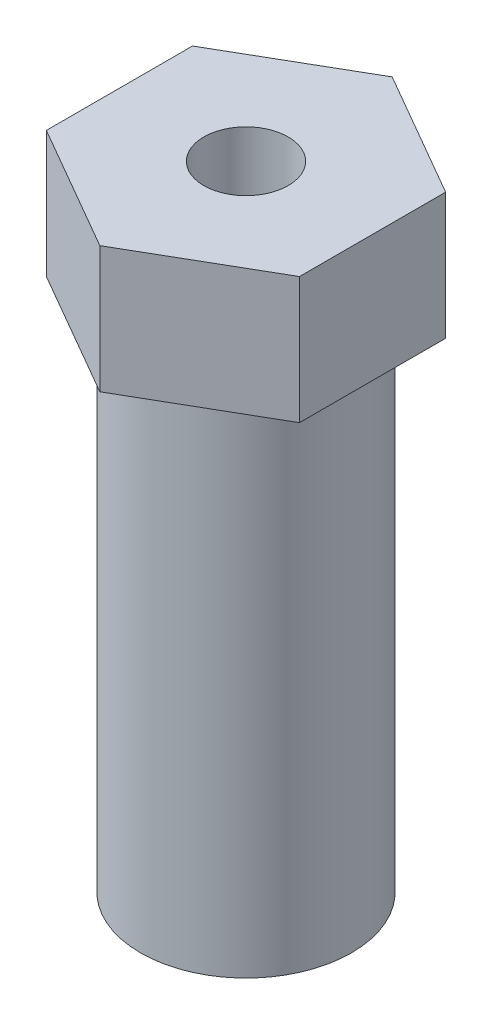
ISO-10303-21;
HEADER;
FILE_DESCRIPTION(('STEP AP214'),'2;1');
FILE_NAME('part.step','',(''),(''),'','','');
FILE_SCHEMA(('AUTOMOTIVE_DESIGN { 1 0 10303 214 1 1 1 1 }'));
ENDSEC;
DATA;
#1=APPLICATION_CONTEXT('core data for automotive mechanical design processes');
#2=APPLICATION_PROTOCOL_DEFINITION('international standard','automotive_design',2000,#1);
#3=PRODUCT_CONTEXT('',#1,'mechanical');
#4=PRODUCT('Part','Part','',(#3));
#5=PRODUCT_RELATED_PRODUCT_CATEGORY('part','',(#4));
#6=PRODUCT_DEFINITION_FORMATION('','',#4);
#7=PRODUCT_DEFINITION_CONTEXT('part definition',#1,'design');
#8=PRODUCT_DEFINITION('design','',#6,#7);
#9=PRODUCT_DEFINITION_SHAPE('','',#8);
#10=(LENGTH_UNIT() NAMED_UNIT(*) SI_UNIT(.MILLI.,.METRE.));
#11=(NAMED_UNIT(*) PLANE_ANGLE_UNIT() SI_UNIT($,.RADIAN.));
#12=(NAMED_UNIT(*) SI_UNIT($,.STERADIAN.) SOLID_ANGLE_UNIT());
#13=UNCERTAINTY_MEASURE_WITH_UNIT(LENGTH_MEASURE(1.E-05),#10,'distance_accuracy_value','');
#14=(GEOMETRIC_REPRESENTATION_CONTEXT(3) GLOBAL_UNCERTAINTY_ASSIGNED_CONTEXT((#13)) GLOBAL_UNIT_ASSIGNED_CONTEXT((#10,
#11,#12)) REPRESENTATION_CONTEXT('',''));
#15=CARTESIAN_POINT('',(0.,0.,0.));
#16=DIRECTION('',(0.,0.,1.));
#17=DIRECTION('',(1.,0.,0.));
#18=AXIS2_PLACEMENT_3D('',#15,#16,#17);
#19=CARTESIAN_POINT('',(0.,30.,0.));
#20=DIRECTION('',(0.,-1.,0.));
#21=DIRECTION('',(0.,0.,-1.));
#22=AXIS2_PLACEMENT_3D('',#19,#20,#21);
#23=CYLINDRICAL_SURFACE('',#22,5.);
#24=CARTESIAN_POINT('',(0.,0.,0.));
#25=DIRECTION('',(0.,1.,0.));
#26=DIRECTION('',(0.,0.,1.));
#27=AXIS2_PLACEMENT_3D('',#24,#25,#26);
#28=CIRCLE('',#27,5.);
#29=CARTESIAN_POINT('',(0.,0.,5.));
#30=VERTEX_POINT('',#29);
#31=EDGE_CURVE('E53',#30,#30,#28,.T.);
#32=ORIENTED_EDGE('',*,*,#31,.T.);
#33=EDGE_LOOP('',(#32));
#34=FACE_BOUND('',#33,.T.);
#35=CARTESIAN_POINT('',(0.,24.,0.));
#36=DIRECTION('',(0.,1.,0.));
#37=DIRECTION('',(0.,0.,1.));
#38=AXIS2_PLACEMENT_3D('',#35,#36,#37);
#39=CIRCLE('',#38,5.);
#40=CARTESIAN_POINT('',(0.,24.,5.));
#41=VERTEX_POINT('',#40);
#42=EDGE_CURVE('E11',#41,#41,#39,.T.);
#43=ORIENTED_EDGE('',*,*,#42,.F.);
#44=EDGE_LOOP('',(#43));
#45=FACE_BOUND('',#44,.T.);
#46=ADVANCED_FACE('F43',(#34,#45),#23,.T.);
#47=CARTESIAN_POINT('',(0.,30.,0.));
#48=DIRECTION('',(0.,-1.,0.));
#49=DIRECTION('',(0.,0.,-1.));
#50=AXIS2_PLACEMENT_3D('',#47,#48,#49);
#51=CYLINDRICAL_SURFACE('',#50,2.5);
#52=CARTESIAN_POINT('',(0.,0.,0.));
#53=DIRECTION('',(0.,1.,0.));
#54=DIRECTION('',(0.,0.,1.));
#55=AXIS2_PLACEMENT_3D('',#52,#53,#54);
#56=CIRCLE('',#55,2.5);
#57=CARTESIAN_POINT('',(0.,0.,2.5));
#58=VERTEX_POINT('',#57);
#59=EDGE_CURVE('E172',#58,#58,#56,.T.);
#60=ORIENTED_EDGE('',*,*,#59,.F.);
#61=EDGE_LOOP('',(#60));
#62=FACE_BOUND('',#61,.T.);
#63=CARTESIAN_POINT('',(0.,24.,0.));
#64=DIRECTION('',(0.,1.,0.));
#65=DIRECTION('',(0.,0.,1.));
#66=AXIS2_PLACEMENT_3D('',#63,#64,#65);
#67=CIRCLE('',#66,2.5);
#68=CARTESIAN_POINT('',(0.,24.,2.5));
#69=VERTEX_POINT('',#68);
#70=EDGE_CURVE('E46',#69,#69,#67,.T.);
#71=ORIENTED_EDGE('',*,*,#70,.T.);
#72=EDGE_LOOP('',(#71));
#73=FACE_BOUND('',#72,.T.);
#74=ADVANCED_FACE('F185',(#62,#73),#51,.F.);
#75=CARTESIAN_POINT('',(0.,0.,0.));
#76=DIRECTION('',(0.,1.,0.));
#77=DIRECTION('',(0.,0.,1.));
#78=AXIS2_PLACEMENT_3D('',#75,#76,#77);
#79=PLANE('',#78);
#80=ORIENTED_EDGE('',*,*,#31,.F.);
#81=EDGE_LOOP('',(#80));
#82=FACE_BOUND('',#81,.T.);
#83=ORIENTED_EDGE('',*,*,#59,.T.);
#84=EDGE_LOOP('',(#83));
#85=FACE_BOUND('',#84,.T.);
#86=ADVANCED_FACE('F181',(#82,#85),#79,.F.);
#87=CARTESIAN_POINT('',(0.,24.,0.));
#88=DIRECTION('',(0.,1.,0.));
#89=DIRECTION('',(0.,0.,1.));
#90=AXIS2_PLACEMENT_3D('',#87,#88,#89);
#91=PLANE('',#90);
#92=CARTESIAN_POINT('',(0.,24.,0.));
#93=DIRECTION('',(0.,1.,0.));
#94=DIRECTION('',(0.,0.,1.));
#95=AXIS2_PLACEMENT_3D('',#92,#93,#94);
#96=CIRCLE('',#95,2.);
#97=CARTESIAN_POINT('',(0.,24.,2.));
#98=VERTEX_POINT('',#97);
#99=EDGE_CURVE('E143',#98,#98,#96,.T.);
#100=ORIENTED_EDGE('',*,*,#99,.T.);
#101=EDGE_LOOP('',(#100));
#102=FACE_BOUND('',#101,.T.);
#103=ORIENTED_EDGE('',*,*,#70,.F.);
#104=EDGE_LOOP('',(#103));
#105=FACE_BOUND('',#104,.T.);
#106=ADVANCED_FACE('F184',(#102,#105),#91,.F.);
#107=CARTESIAN_POINT('',(0.,24.,0.));
#108=DIRECTION('',(0.,1.,0.));
#109=DIRECTION('',(0.,0.,1.));
#110=AXIS2_PLACEMENT_3D('',#107,#108,#109);
#111=CYLINDRICAL_SURFACE('',#110,2.);
#112=ORIENTED_EDGE('',*,*,#99,.F.);
#113=EDGE_LOOP('',(#112));
#114=FACE_BOUND('',#113,.T.);
#115=CARTESIAN_POINT('',(0.,30.,0.));
#116=DIRECTION('',(0.,1.,0.));
#117=DIRECTION('',(0.,0.,1.));
#118=AXIS2_PLACEMENT_3D('',#115,#116,#117);
#119=CIRCLE('',#118,2.);
#120=CARTESIAN_POINT('',(0.,30.,2.));
#121=VERTEX_POINT('',#120);
#122=EDGE_CURVE('E339',#121,#121,#119,.T.);
#123=ORIENTED_EDGE('',*,*,#122,.T.);
#124=EDGE_LOOP('',(#123));
#125=FACE_BOUND('',#124,.T.);
#126=ADVANCED_FACE('F196',(#114,#125),#111,.F.);
#127=CARTESIAN_POINT('',(0.,30.,0.));
#128=DIRECTION('',(0.,1.,0.));
#129=DIRECTION('',(0.,0.,1.));
#130=AXIS2_PLACEMENT_3D('',#127,#128,#129);
#131=PLANE('',#130);
#132=ORIENTED_EDGE('',*,*,#122,.F.);
#133=EDGE_LOOP('',(#132));
#134=FACE_BOUND('',#133,.T.);
#135=DIRECTION('',(-0.866025403784439,0.,-0.5));
#136=VECTOR('',#135,1.);
#137=CARTESIAN_POINT('',(6.,30.,-3.46410161513776));
#138=LINE('',#137,#136);
#139=CARTESIAN_POINT('',(6.,30.,-3.46410161513776));
#140=VERTEX_POINT('',#139);
#141=CARTESIAN_POINT('',(0.,30.,-6.92820323027551));
#142=VERTEX_POINT('',#141);
#143=EDGE_CURVE('E138',#140,#142,#138,.T.);
#144=ORIENTED_EDGE('',*,*,#143,.T.);
#145=DIRECTION('',(-0.866025403784439,0.,0.5));
#146=VECTOR('',#145,1.);
#147=CARTESIAN_POINT('',(0.,30.,-6.92820323027551));
#148=LINE('',#147,#146);
#149=CARTESIAN_POINT('',(-6.,30.,-3.46410161513776));
#150=VERTEX_POINT('',#149);
#151=EDGE_CURVE('E142',#142,#150,#148,.T.);
#152=ORIENTED_EDGE('',*,*,#151,.T.);
#153=DIRECTION('',(0.,0.,1.));
#154=VECTOR('',#153,1.);
#155=CARTESIAN_POINT('',(-6.,30.,-3.46410161513776));
#156=LINE('',#155,#154);
#157=CARTESIAN_POINT('',(-6.,30.,3.46410161513775));
#158=VERTEX_POINT('',#157);
#159=EDGE_CURVE('E147',#150,#158,#156,.T.);
#160=ORIENTED_EDGE('',*,*,#159,.T.);
#161=DIRECTION('',(0.866025403784439,0.,0.5));
#162=VECTOR('',#161,1.);
#163=CARTESIAN_POINT('',(-6.,30.,3.46410161513775));
#164=LINE('',#163,#162);
#165=CARTESIAN_POINT('',(0.,30.,6.92820323027551));
#166=VERTEX_POINT('',#165);
#167=EDGE_CURVE('E151',#158,#166,#164,.T.);
#168=ORIENTED_EDGE('',*,*,#167,.T.);
#169=DIRECTION('',(0.866025403784439,0.,-0.5));
#170=VECTOR('',#169,1.);
#171=CARTESIAN_POINT('',(0.,30.,6.92820323027551));
#172=LINE('',#171,#170);
#173=CARTESIAN_POINT('',(6.,30.,3.46410161513776));
#174=VERTEX_POINT('',#173);
#175=EDGE_CURVE('E110',#166,#174,#172,.T.);
#176=ORIENTED_EDGE('',*,*,#175,.T.);
#177=DIRECTION('',(0.,0.,-1.));
#178=VECTOR('',#177,1.);
#179=CARTESIAN_POINT('',(6.,30.,3.46410161513776));
#180=LINE('',#179,#178);
#181=EDGE_CURVE('E156',#174,#140,#180,.T.);
#182=ORIENTED_EDGE('',*,*,#181,.T.);
#183=EDGE_LOOP('',(#144,#152,#160,#168,#176,#182));
#184=FACE_BOUND('',#183,.T.);
#185=ADVANCED_FACE('F202',(#134,#184),#131,.T.);
#186=CARTESIAN_POINT('',(6.,24.,-3.46410161513776));
#187=DIRECTION('',(0.5,0.,-0.866025403784439));
#188=DIRECTION('',(-0.866025403784439,0.,-0.5));
#189=AXIS2_PLACEMENT_3D('',#186,#187,#188);
#190=PLANE('',#189);
#191=ORIENTED_EDGE('',*,*,#143,.F.);
#192=DIRECTION('',(0.,1.,0.));
#193=VECTOR('',#192,1.);
#194=CARTESIAN_POINT('',(6.,24.,-3.46410161513776));
#195=LINE('',#194,#193);
#196=CARTESIAN_POINT('',(6.,24.,-3.46410161513776));
#197=VERTEX_POINT('',#196);
#198=EDGE_CURVE('E62',#197,#140,#195,.T.);
#199=ORIENTED_EDGE('',*,*,#198,.F.);
#200=DIRECTION('',(-0.866025403784439,0.,-0.5));
#201=VECTOR('',#200,1.);
#202=CARTESIAN_POINT('',(6.,24.,-3.46410161513776));
#203=LINE('',#202,#201);
#204=CARTESIAN_POINT('',(0.,24.,-6.92820323027551));
#205=VERTEX_POINT('',#204);
#206=EDGE_CURVE('E160',#197,#205,#203,.T.);
#207=ORIENTED_EDGE('',*,*,#206,.T.);
#208=DIRECTION('',(0.,1.,0.));
#209=VECTOR('',#208,1.);
#210=CARTESIAN_POINT('',(0.,24.,-6.92820323027551));
#211=LINE('',#210,#209);
#212=EDGE_CURVE('E97',#205,#142,#211,.T.);
#213=ORIENTED_EDGE('',*,*,#212,.T.);
#214=EDGE_LOOP('',(#191,#199,#207,#213));
#215=FACE_BOUND('',#214,.T.);
#216=ADVANCED_FACE('F259',(#215),#190,.T.);
#217=CARTESIAN_POINT('',(6.,24.,3.46410161513776));
#218=DIRECTION('',(1.,0.,0.));
#219=DIRECTION('',(0.,0.,-1.));
#220=AXIS2_PLACEMENT_3D('',#217,#218,#219);
#221=PLANE('',#220);
#222=ORIENTED_EDGE('',*,*,#181,.F.);
#223=DIRECTION('',(0.,1.,0.));
#224=VECTOR('',#223,1.);
#225=CARTESIAN_POINT('',(6.,24.,3.46410161513776));
#226=LINE('',#225,#224);
#227=CARTESIAN_POINT('',(6.,24.,3.46410161513776));
#228=VERTEX_POINT('',#227);
#229=EDGE_CURVE('E85',#228,#174,#226,.T.);
#230=ORIENTED_EDGE('',*,*,#229,.F.);
#231=DIRECTION('',(0.,0.,-1.));
#232=VECTOR('',#231,1.);
#233=CARTESIAN_POINT('',(6.,24.,3.46410161513776));
#234=LINE('',#233,#232);
#235=EDGE_CURVE('E124',#228,#197,#234,.T.);
#236=ORIENTED_EDGE('',*,*,#235,.T.);
#237=ORIENTED_EDGE('',*,*,#198,.T.);
#238=EDGE_LOOP('',(#222,#230,#236,#237));
#239=FACE_BOUND('',#238,.T.);
#240=ADVANCED_FACE('F268',(#239),#221,.T.);
#241=CARTESIAN_POINT('',(0.,24.,6.92820323027551));
#242=DIRECTION('',(0.5,0.,0.866025403784439));
#243=DIRECTION('',(0.866025403784439,0.,-0.5));
#244=AXIS2_PLACEMENT_3D('',#241,#242,#243);
#245=PLANE('',#244);
#246=ORIENTED_EDGE('',*,*,#175,.F.);
#247=DIRECTION('',(0.,1.,0.));
#248=VECTOR('',#247,1.);
#249=CARTESIAN_POINT('',(0.,24.,6.92820323027551));
#250=LINE('',#249,#248);
#251=CARTESIAN_POINT('',(0.,24.,6.92820323027551));
#252=VERTEX_POINT('',#251);
#253=EDGE_CURVE('E105',#252,#166,#250,.T.);
#254=ORIENTED_EDGE('',*,*,#253,.F.);
#255=DIRECTION('',(0.866025403784439,0.,-0.5));
#256=VECTOR('',#255,1.);
#257=CARTESIAN_POINT('',(0.,24.,6.92820323027551));
#258=LINE('',#257,#256);
#259=EDGE_CURVE('E108',#252,#228,#258,.T.);
#260=ORIENTED_EDGE('',*,*,#259,.T.);
#261=ORIENTED_EDGE('',*,*,#229,.T.);
#262=EDGE_LOOP('',(#246,#254,#260,#261));
#263=FACE_BOUND('',#262,.T.);
#264=ADVANCED_FACE('F107',(#263),#245,.T.);
#265=CARTESIAN_POINT('',(-6.,24.,3.46410161513775));
#266=DIRECTION('',(-0.5,0.,0.866025403784439));
#267=DIRECTION('',(0.866025403784439,0.,0.5));
#268=AXIS2_PLACEMENT_3D('',#265,#266,#267);
#269=PLANE('',#268);
#270=ORIENTED_EDGE('',*,*,#167,.F.);
#271=DIRECTION('',(0.,1.,0.));
#272=VECTOR('',#271,1.);
#273=CARTESIAN_POINT('',(-6.,24.,3.46410161513775));
#274=LINE('',#273,#272);
#275=CARTESIAN_POINT('',(-6.,24.,3.46410161513775));
#276=VERTEX_POINT('',#275);
#277=EDGE_CURVE('E116',#276,#158,#274,.T.);
#278=ORIENTED_EDGE('',*,*,#277,.F.);
#279=DIRECTION('',(0.866025403784439,0.,0.5));
#280=VECTOR('',#279,1.);
#281=CARTESIAN_POINT('',(-6.,24.,3.46410161513775));
#282=LINE('',#281,#280);
#283=EDGE_CURVE('E122',#276,#252,#282,.T.);
#284=ORIENTED_EDGE('',*,*,#283,.T.);
#285=ORIENTED_EDGE('',*,*,#253,.T.);
#286=EDGE_LOOP('',(#270,#278,#284,#285));
#287=FACE_BOUND('',#286,.T.);
#288=ADVANCED_FACE('F127',(#287),#269,.T.);
#289=CARTESIAN_POINT('',(-6.,24.,-3.46410161513776));
#290=DIRECTION('',(-1.,0.,0.));
#291=DIRECTION('',(0.,0.,1.));
#292=AXIS2_PLACEMENT_3D('',#289,#290,#291);
#293=PLANE('',#292);
#294=ORIENTED_EDGE('',*,*,#159,.F.);
#295=DIRECTION('',(0.,1.,0.));
#296=VECTOR('',#295,1.);
#297=CARTESIAN_POINT('',(-6.,24.,-3.46410161513776));
#298=LINE('',#297,#296);
#299=CARTESIAN_POINT('',(-6.,24.,-3.46410161513776));
#300=VERTEX_POINT('',#299);
#301=EDGE_CURVE('E167',#300,#150,#298,.T.);
#302=ORIENTED_EDGE('',*,*,#301,.F.);
#303=DIRECTION('',(0.,0.,1.));
#304=VECTOR('',#303,1.);
#305=CARTESIAN_POINT('',(-6.,24.,-3.46410161513776));
#306=LINE('',#305,#304);
#307=EDGE_CURVE('E129',#300,#276,#306,.T.);
#308=ORIENTED_EDGE('',*,*,#307,.T.);
#309=ORIENTED_EDGE('',*,*,#277,.T.);
#310=EDGE_LOOP('',(#294,#302,#308,#309));
#311=FACE_BOUND('',#310,.T.);
#312=ADVANCED_FACE('F295',(#311),#293,.T.);
#313=CARTESIAN_POINT('',(0.,24.,-6.92820323027551));
#314=DIRECTION('',(-0.5,0.,-0.866025403784439));
#315=DIRECTION('',(-0.866025403784439,0.,0.5));
#316=AXIS2_PLACEMENT_3D('',#313,#314,#315);
#317=PLANE('',#316);
#318=ORIENTED_EDGE('',*,*,#151,.F.);
#319=ORIENTED_EDGE('',*,*,#212,.F.);
#320=DIRECTION('',(-0.866025403784439,0.,0.5));
#321=VECTOR('',#320,1.);
#322=CARTESIAN_POINT('',(0.,24.,-6.92820323027551));
#323=LINE('',#322,#321);
#324=EDGE_CURVE('E132',#205,#300,#323,.T.);
#325=ORIENTED_EDGE('',*,*,#324,.T.);
#326=ORIENTED_EDGE('',*,*,#301,.T.);
#327=EDGE_LOOP('',(#318,#319,#325,#326));
#328=FACE_BOUND('',#327,.T.);
#329=ADVANCED_FACE('F208',(#328),#317,.T.);
#330=ORIENTED_EDGE('',*,*,#42,.T.);
#331=EDGE_LOOP('',(#330));
#332=FACE_BOUND('',#331,.T.);
#333=ORIENTED_EDGE('',*,*,#206,.F.);
#334=ORIENTED_EDGE('',*,*,#235,.F.);
#335=ORIENTED_EDGE('',*,*,#259,.F.);
#336=ORIENTED_EDGE('',*,*,#283,.F.);
#337=ORIENTED_EDGE('',*,*,#307,.F.);
#338=ORIENTED_EDGE('',*,*,#324,.F.);
#339=EDGE_LOOP('',(#333,#334,#335,#336,#337,#338));
#340=FACE_BOUND('',#339,.T.);
#341=ADVANCED_FACE('F120',(#332,#340),#91,.F.);
#342=CLOSED_SHELL('',(#46,#74,#86,#106,#126,#185,#216,#240,#264,#288,#312,#329,#341));
#343=MANIFOLD_SOLID_BREP('B2',#342);
#344=ADVANCED_BREP_SHAPE_REPRESENTATION('',(#18,#343),#14);
#345=SHAPE_DEFINITION_REPRESENTATION(#9,#344);
ENDSEC;
END-ISO-10303-21;
